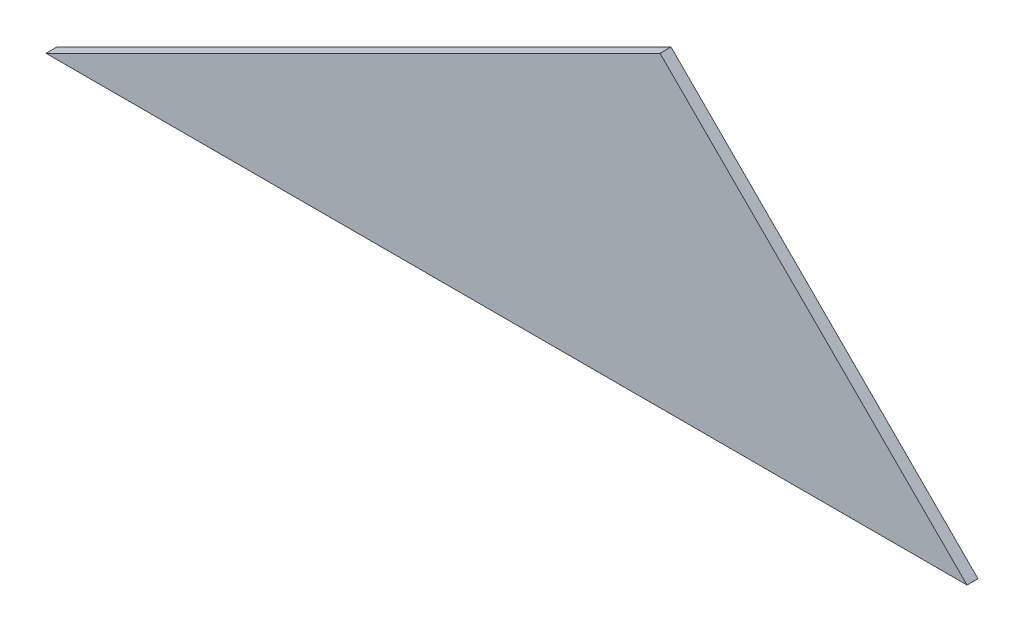
ISO-10303-21;
HEADER;
FILE_DESCRIPTION(('STEP AP214'),'2;1');
FILE_NAME('part.step','',(''),(''),'','','');
FILE_SCHEMA(('AUTOMOTIVE_DESIGN { 1 0 10303 214 1 1 1 1 }'));
ENDSEC;
DATA;
#1=APPLICATION_CONTEXT('core data for automotive mechanical design processes');
#2=APPLICATION_PROTOCOL_DEFINITION('international standard','automotive_design',2000,#1);
#3=PRODUCT_CONTEXT('',#1,'mechanical');
#4=PRODUCT('Part','Part','',(#3));
#5=PRODUCT_RELATED_PRODUCT_CATEGORY('part','',(#4));
#6=PRODUCT_DEFINITION_FORMATION('','',#4);
#7=PRODUCT_DEFINITION_CONTEXT('part definition',#1,'design');
#8=PRODUCT_DEFINITION('design','',#6,#7);
#9=PRODUCT_DEFINITION_SHAPE('','',#8);
#10=(LENGTH_UNIT() NAMED_UNIT(*) SI_UNIT(.MILLI.,.METRE.));
#11=(NAMED_UNIT(*) PLANE_ANGLE_UNIT() SI_UNIT($,.RADIAN.));
#12=(NAMED_UNIT(*) SI_UNIT($,.STERADIAN.) SOLID_ANGLE_UNIT());
#13=UNCERTAINTY_MEASURE_WITH_UNIT(LENGTH_MEASURE(1.E-05),#10,'distance_accuracy_value','');
#14=(GEOMETRIC_REPRESENTATION_CONTEXT(3) GLOBAL_UNCERTAINTY_ASSIGNED_CONTEXT((#13)) GLOBAL_UNIT_ASSIGNED_CONTEXT((#10,
#11,#12)) REPRESENTATION_CONTEXT('',''));
#15=CARTESIAN_POINT('',(0.,0.,0.));
#16=DIRECTION('',(0.,0.,1.));
#17=DIRECTION('',(1.,0.,0.));
#18=AXIS2_PLACEMENT_3D('',#15,#16,#17);
#19=CARTESIAN_POINT('',(140.,70.,2.5));
#20=DIRECTION('',(0.447213595499958,-0.894427190999916,0.));
#21=DIRECTION('',(0.894427190999916,0.447213595499958,0.));
#22=AXIS2_PLACEMENT_3D('',#19,#20,#21);
#23=PLANE('',#22);
#24=DIRECTION('',(-0.894427190999916,-0.447213595499958,0.));
#25=VECTOR('',#24,1.);
#26=CARTESIAN_POINT('',(140.,70.,0.));
#27=LINE('',#26,#25);
#28=CARTESIAN_POINT('',(140.,70.,0.));
#29=VERTEX_POINT('',#28);
#30=CARTESIAN_POINT('',(0.,0.,0.));
#31=VERTEX_POINT('',#30);
#32=EDGE_CURVE('E88',#29,#31,#27,.T.);
#33=ORIENTED_EDGE('',*,*,#32,.T.);
#34=DIRECTION('',(0.,0.,-1.));
#35=VECTOR('',#34,1.);
#36=CARTESIAN_POINT('',(0.,0.,2.5));
#37=LINE('',#36,#35);
#38=CARTESIAN_POINT('',(0.,0.,2.5));
#39=VERTEX_POINT('',#38);
#40=EDGE_CURVE('E11',#39,#31,#37,.T.);
#41=ORIENTED_EDGE('',*,*,#40,.F.);
#42=DIRECTION('',(-0.894427190999916,-0.447213595499958,0.));
#43=VECTOR('',#42,1.);
#44=CARTESIAN_POINT('',(140.,70.,2.5));
#45=LINE('',#44,#43);
#46=CARTESIAN_POINT('',(140.,70.,2.5));
#47=VERTEX_POINT('',#46);
#48=EDGE_CURVE('E81',#47,#39,#45,.T.);
#49=ORIENTED_EDGE('',*,*,#48,.F.);
#50=DIRECTION('',(0.,0.,-1.));
#51=VECTOR('',#50,1.);
#52=CARTESIAN_POINT('',(140.,70.,2.5));
#53=LINE('',#52,#51);
#54=EDGE_CURVE('E89',#47,#29,#53,.T.);
#55=ORIENTED_EDGE('',*,*,#54,.T.);
#56=EDGE_LOOP('',(#33,#41,#49,#55));
#57=FACE_BOUND('',#56,.T.);
#58=ADVANCED_FACE('F41',(#57),#23,.F.);
#59=CARTESIAN_POINT('',(0.,0.,2.5));
#60=DIRECTION('',(0.,1.,0.));
#61=DIRECTION('',(0.,0.,1.));
#62=AXIS2_PLACEMENT_3D('',#59,#60,#61);
#63=PLANE('',#62);
#64=DIRECTION('',(1.,0.,0.));
#65=VECTOR('',#64,1.);
#66=CARTESIAN_POINT('',(0.,0.,0.));
#67=LINE('',#66,#65);
#68=CARTESIAN_POINT('',(210.,0.,0.));
#69=VERTEX_POINT('',#68);
#70=EDGE_CURVE('E69',#31,#69,#67,.T.);
#71=ORIENTED_EDGE('',*,*,#70,.T.);
#72=DIRECTION('',(0.,0.,-1.));
#73=VECTOR('',#72,1.);
#74=CARTESIAN_POINT('',(210.,0.,2.5));
#75=LINE('',#74,#73);
#76=CARTESIAN_POINT('',(210.,0.,2.5));
#77=VERTEX_POINT('',#76);
#78=EDGE_CURVE('E49',#77,#69,#75,.T.);
#79=ORIENTED_EDGE('',*,*,#78,.F.);
#80=DIRECTION('',(1.,0.,0.));
#81=VECTOR('',#80,1.);
#82=CARTESIAN_POINT('',(0.,0.,2.5));
#83=LINE('',#82,#81);
#84=EDGE_CURVE('E77',#39,#77,#83,.T.);
#85=ORIENTED_EDGE('',*,*,#84,.F.);
#86=ORIENTED_EDGE('',*,*,#40,.T.);
#87=EDGE_LOOP('',(#71,#79,#85,#86));
#88=FACE_BOUND('',#87,.T.);
#89=ADVANCED_FACE('F78',(#88),#63,.F.);
#90=CARTESIAN_POINT('',(210.,0.,2.5));
#91=DIRECTION('',(-0.707106781186548,-0.707106781186548,0.));
#92=DIRECTION('',(0.707106781186548,-0.707106781186548,0.));
#93=AXIS2_PLACEMENT_3D('',#90,#91,#92);
#94=PLANE('',#93);
#95=DIRECTION('',(-0.707106781186548,0.707106781186548,0.));
#96=VECTOR('',#95,1.);
#97=CARTESIAN_POINT('',(210.,0.,0.));
#98=LINE('',#97,#96);
#99=EDGE_CURVE('E74',#69,#29,#98,.T.);
#100=ORIENTED_EDGE('',*,*,#99,.T.);
#101=ORIENTED_EDGE('',*,*,#54,.F.);
#102=DIRECTION('',(-0.707106781186548,0.707106781186548,0.));
#103=VECTOR('',#102,1.);
#104=CARTESIAN_POINT('',(210.,0.,2.5));
#105=LINE('',#104,#103);
#106=EDGE_CURVE('E57',#77,#47,#105,.T.);
#107=ORIENTED_EDGE('',*,*,#106,.F.);
#108=ORIENTED_EDGE('',*,*,#78,.T.);
#109=EDGE_LOOP('',(#100,#101,#107,#108));
#110=FACE_BOUND('',#109,.T.);
#111=ADVANCED_FACE('F96',(#110),#94,.F.);
#112=CARTESIAN_POINT('',(0.,0.,2.5));
#113=DIRECTION('',(0.,0.,-1.));
#114=DIRECTION('',(-1.,0.,0.));
#115=AXIS2_PLACEMENT_3D('',#112,#113,#114);
#116=PLANE('',#115);
#117=ORIENTED_EDGE('',*,*,#48,.T.);
#118=ORIENTED_EDGE('',*,*,#84,.T.);
#119=ORIENTED_EDGE('',*,*,#106,.T.);
#120=EDGE_LOOP('',(#117,#118,#119));
#121=FACE_BOUND('',#120,.T.);
#122=ADVANCED_FACE('F84',(#121),#116,.F.);
#123=CARTESIAN_POINT('',(0.,0.,0.));
#124=DIRECTION('',(0.,0.,-1.));
#125=DIRECTION('',(-1.,0.,0.));
#126=AXIS2_PLACEMENT_3D('',#123,#124,#125);
#127=PLANE('',#126);
#128=ORIENTED_EDGE('',*,*,#32,.F.);
#129=ORIENTED_EDGE('',*,*,#99,.F.);
#130=ORIENTED_EDGE('',*,*,#70,.F.);
#131=EDGE_LOOP('',(#128,#129,#130));
#132=FACE_BOUND('',#131,.T.);
#133=ADVANCED_FACE('F97',(#132),#127,.T.);
#134=CLOSED_SHELL('',(#58,#89,#111,#122,#133));
#135=MANIFOLD_SOLID_BREP('B2',#134);
#136=ADVANCED_BREP_SHAPE_REPRESENTATION('',(#18,#135),#14);
#137=SHAPE_DEFINITION_REPRESENTATION(#9,#136);
ENDSEC;
END-ISO-10303-21;
